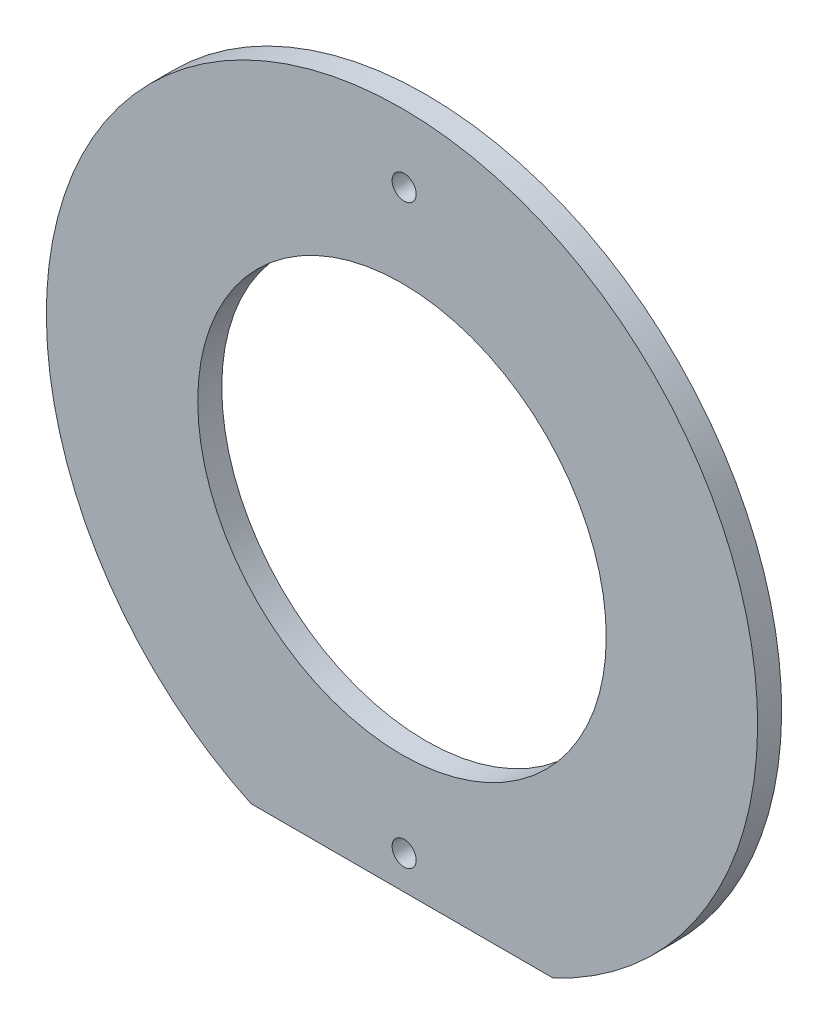
ISO-10303-21;
HEADER;
FILE_DESCRIPTION(('STEP AP214'),'2;1');
FILE_NAME('part.step','',(''),(''),'','','');
FILE_SCHEMA(('AUTOMOTIVE_DESIGN { 1 0 10303 214 1 1 1 1 }'));
ENDSEC;
DATA;
#1=APPLICATION_CONTEXT('core data for automotive mechanical design processes');
#2=APPLICATION_PROTOCOL_DEFINITION('international standard','automotive_design',2000,#1);
#3=PRODUCT_CONTEXT('',#1,'mechanical');
#4=PRODUCT('Part','Part','',(#3));
#5=PRODUCT_RELATED_PRODUCT_CATEGORY('part','',(#4));
#6=PRODUCT_DEFINITION_FORMATION('','',#4);
#7=PRODUCT_DEFINITION_CONTEXT('part definition',#1,'design');
#8=PRODUCT_DEFINITION('design','',#6,#7);
#9=PRODUCT_DEFINITION_SHAPE('','',#8);
#10=(LENGTH_UNIT() NAMED_UNIT(*) SI_UNIT(.MILLI.,.METRE.));
#11=(NAMED_UNIT(*) PLANE_ANGLE_UNIT() SI_UNIT($,.RADIAN.));
#12=(NAMED_UNIT(*) SI_UNIT($,.STERADIAN.) SOLID_ANGLE_UNIT());
#13=UNCERTAINTY_MEASURE_WITH_UNIT(LENGTH_MEASURE(1.E-05),#10,'distance_accuracy_value','');
#14=(GEOMETRIC_REPRESENTATION_CONTEXT(3) GLOBAL_UNCERTAINTY_ASSIGNED_CONTEXT((#13)) GLOBAL_UNIT_ASSIGNED_CONTEXT((#10,
#11,#12)) REPRESENTATION_CONTEXT('',''));
#15=CARTESIAN_POINT('',(0.,0.,0.));
#16=DIRECTION('',(0.,0.,1.));
#17=DIRECTION('',(1.,0.,0.));
#18=AXIS2_PLACEMENT_3D('',#15,#16,#17);
#19=CARTESIAN_POINT('',(-94.397031795319,72.5024096010838,5.));
#20=DIRECTION('',(0.,0.,-1.));
#21=DIRECTION('',(-1.,0.,0.));
#22=AXIS2_PLACEMENT_3D('',#19,#20,#21);
#23=CYLINDRICAL_SURFACE('',#22,74.);
#24=CARTESIAN_POINT('',(-94.397031795319,72.5024096010838,0.));
#25=DIRECTION('',(0.,0.,1.));
#26=DIRECTION('',(1.,0.,0.));
#27=AXIS2_PLACEMENT_3D('',#24,#25,#26);
#28=CIRCLE('',#27,74.);
#29=CARTESIAN_POINT('',(-62.980475650509,5.50240960108384,0.));
#30=VERTEX_POINT('',#29);
#31=CARTESIAN_POINT('',(-125.813587940129,5.50240960108384,0.));
#32=VERTEX_POINT('',#31);
#33=EDGE_CURVE('E72',#30,#32,#28,.T.);
#34=ORIENTED_EDGE('',*,*,#33,.T.);
#35=DIRECTION('',(0.,0.,-1.));
#36=VECTOR('',#35,1.);
#37=CARTESIAN_POINT('',(-125.813587940129,5.50240960108384,5.));
#38=LINE('',#37,#36);
#39=CARTESIAN_POINT('',(-125.813587940129,5.50240960108384,5.));
#40=VERTEX_POINT('',#39);
#41=EDGE_CURVE('E11',#40,#32,#38,.T.);
#42=ORIENTED_EDGE('',*,*,#41,.F.);
#43=CARTESIAN_POINT('',(-94.397031795319,72.5024096010838,5.));
#44=DIRECTION('',(0.,0.,1.));
#45=DIRECTION('',(1.,0.,0.));
#46=AXIS2_PLACEMENT_3D('',#43,#44,#45);
#47=CIRCLE('',#46,74.);
#48=CARTESIAN_POINT('',(-62.980475650509,5.50240960108384,5.));
#49=VERTEX_POINT('',#48);
#50=EDGE_CURVE('E71',#49,#40,#47,.T.);
#51=ORIENTED_EDGE('',*,*,#50,.F.);
#52=DIRECTION('',(0.,0.,-1.));
#53=VECTOR('',#52,1.);
#54=CARTESIAN_POINT('',(-62.980475650509,5.50240960108384,5.));
#55=LINE('',#54,#53);
#56=EDGE_CURVE('E48',#49,#30,#55,.T.);
#57=ORIENTED_EDGE('',*,*,#56,.T.);
#58=EDGE_LOOP('',(#34,#42,#51,#57));
#59=FACE_BOUND('',#58,.T.);
#60=ADVANCED_FACE('F39',(#59),#23,.T.);
#61=CARTESIAN_POINT('',(-125.813587940129,5.50240960108384,5.));
#62=DIRECTION('',(0.,1.,0.));
#63=DIRECTION('',(0.,0.,1.));
#64=AXIS2_PLACEMENT_3D('',#61,#62,#63);
#65=PLANE('',#64);
#66=DIRECTION('',(1.,0.,0.));
#67=VECTOR('',#66,1.);
#68=CARTESIAN_POINT('',(-125.813587940129,5.50240960108384,0.));
#69=LINE('',#68,#67);
#70=EDGE_CURVE('E64',#32,#30,#69,.T.);
#71=ORIENTED_EDGE('',*,*,#70,.T.);
#72=ORIENTED_EDGE('',*,*,#56,.F.);
#73=DIRECTION('',(1.,0.,0.));
#74=VECTOR('',#73,1.);
#75=CARTESIAN_POINT('',(-125.813587940129,5.50240960108384,5.));
#76=LINE('',#75,#74);
#77=EDGE_CURVE('E56',#40,#49,#76,.T.);
#78=ORIENTED_EDGE('',*,*,#77,.F.);
#79=ORIENTED_EDGE('',*,*,#41,.T.);
#80=EDGE_LOOP('',(#71,#72,#78,#79));
#81=FACE_BOUND('',#80,.T.);
#82=ADVANCED_FACE('F67',(#81),#65,.F.);
#83=CARTESIAN_POINT('',(-94.397031795319,72.5024096010838,5.));
#84=DIRECTION('',(0.,0.,1.));
#85=DIRECTION('',(1.,0.,0.));
#86=AXIS2_PLACEMENT_3D('',#83,#84,#85);
#87=PLANE('',#86);
#88=CARTESIAN_POINT('',(-94.397031795319,72.5024096010838,5.));
#89=DIRECTION('',(0.,0.,1.));
#90=DIRECTION('',(1.,0.,0.));
#91=AXIS2_PLACEMENT_3D('',#88,#89,#90);
#92=CIRCLE('',#91,42.5);
#93=CARTESIAN_POINT('',(-51.897031795319,72.5024096010838,5.));
#94=VERTEX_POINT('',#93);
#95=EDGE_CURVE('E158',#94,#94,#92,.T.);
#96=ORIENTED_EDGE('',*,*,#95,.F.);
#97=EDGE_LOOP('',(#96));
#98=FACE_BOUND('',#97,.T.);
#99=CARTESIAN_POINT('',(-93.9533952640978,132.502409601084,5.));
#100=DIRECTION('',(0.,0.,1.));
#101=DIRECTION('',(1.,0.,0.));
#102=AXIS2_PLACEMENT_3D('',#99,#100,#101);
#103=CIRCLE('',#102,2.5);
#104=CARTESIAN_POINT('',(-91.4533952640978,132.502409601084,5.));
#105=VERTEX_POINT('',#104);
#106=EDGE_CURVE('E83',#105,#105,#103,.T.);
#107=ORIENTED_EDGE('',*,*,#106,.F.);
#108=EDGE_LOOP('',(#107));
#109=FACE_BOUND('',#108,.T.);
#110=CARTESIAN_POINT('',(-93.9533952640978,12.5024096010838,5.));
#111=DIRECTION('',(0.,0.,1.));
#112=DIRECTION('',(1.,0.,0.));
#113=AXIS2_PLACEMENT_3D('',#110,#111,#112);
#114=CIRCLE('',#113,2.5);
#115=CARTESIAN_POINT('',(-91.4533952640978,12.5024096010838,5.));
#116=VERTEX_POINT('',#115);
#117=EDGE_CURVE('E87',#116,#116,#114,.T.);
#118=ORIENTED_EDGE('',*,*,#117,.F.);
#119=EDGE_LOOP('',(#118));
#120=FACE_BOUND('',#119,.T.);
#121=ORIENTED_EDGE('',*,*,#50,.T.);
#122=ORIENTED_EDGE('',*,*,#77,.T.);
#123=EDGE_LOOP('',(#121,#122));
#124=FACE_BOUND('',#123,.T.);
#125=ADVANCED_FACE('F96',(#98,#109,#120,#124),#87,.T.);
#126=CARTESIAN_POINT('',(-94.397031795319,72.5024096010838,0.));
#127=DIRECTION('',(0.,0.,1.));
#128=DIRECTION('',(1.,0.,0.));
#129=AXIS2_PLACEMENT_3D('',#126,#127,#128);
#130=PLANE('',#129);
#131=CARTESIAN_POINT('',(-94.397031795319,72.5024096010838,0.));
#132=DIRECTION('',(0.,0.,1.));
#133=DIRECTION('',(1.,0.,0.));
#134=AXIS2_PLACEMENT_3D('',#131,#132,#133);
#135=CIRCLE('',#134,42.5);
#136=CARTESIAN_POINT('',(-51.897031795319,72.5024096010838,0.));
#137=VERTEX_POINT('',#136);
#138=EDGE_CURVE('E92',#137,#137,#135,.F.);
#139=ORIENTED_EDGE('',*,*,#138,.F.);
#140=EDGE_LOOP('',(#139));
#141=FACE_BOUND('',#140,.T.);
#142=CARTESIAN_POINT('',(-93.9533952640978,132.502409601084,0.));
#143=DIRECTION('',(0.,0.,1.));
#144=DIRECTION('',(1.,0.,0.));
#145=AXIS2_PLACEMENT_3D('',#142,#143,#144);
#146=CIRCLE('',#145,2.5);
#147=CARTESIAN_POINT('',(-91.4533952640978,132.502409601084,0.));
#148=VERTEX_POINT('',#147);
#149=EDGE_CURVE('E42',#148,#148,#146,.T.);
#150=ORIENTED_EDGE('',*,*,#149,.T.);
#151=EDGE_LOOP('',(#150));
#152=FACE_BOUND('',#151,.T.);
#153=CARTESIAN_POINT('',(-93.9533952640978,12.5024096010838,0.));
#154=DIRECTION('',(0.,0.,1.));
#155=DIRECTION('',(1.,0.,0.));
#156=AXIS2_PLACEMENT_3D('',#153,#154,#155);
#157=CIRCLE('',#156,2.5);
#158=CARTESIAN_POINT('',(-91.4533952640978,12.5024096010838,0.));
#159=VERTEX_POINT('',#158);
#160=EDGE_CURVE('E79',#159,#159,#157,.T.);
#161=ORIENTED_EDGE('',*,*,#160,.T.);
#162=EDGE_LOOP('',(#161));
#163=FACE_BOUND('',#162,.T.);
#164=ORIENTED_EDGE('',*,*,#33,.F.);
#165=ORIENTED_EDGE('',*,*,#70,.F.);
#166=EDGE_LOOP('',(#164,#165));
#167=FACE_BOUND('',#166,.T.);
#168=ADVANCED_FACE('F76',(#141,#152,#163,#167),#130,.F.);
#169=CARTESIAN_POINT('',(-93.9533952640978,12.5024096010838,-5.));
#170=DIRECTION('',(0.,0.,1.));
#171=DIRECTION('',(1.,0.,0.));
#172=AXIS2_PLACEMENT_3D('',#169,#170,#171);
#173=CYLINDRICAL_SURFACE('',#172,2.5);
#174=ORIENTED_EDGE('',*,*,#117,.T.);
#175=EDGE_LOOP('',(#174));
#176=FACE_BOUND('',#175,.T.);
#177=ORIENTED_EDGE('',*,*,#160,.F.);
#178=EDGE_LOOP('',(#177));
#179=FACE_BOUND('',#178,.T.);
#180=ADVANCED_FACE('F104',(#176,#179),#173,.F.);
#181=CARTESIAN_POINT('',(-93.9533952640978,132.502409601084,-5.));
#182=DIRECTION('',(0.,0.,1.));
#183=DIRECTION('',(1.,0.,0.));
#184=AXIS2_PLACEMENT_3D('',#181,#182,#183);
#185=CYLINDRICAL_SURFACE('',#184,2.5);
#186=ORIENTED_EDGE('',*,*,#106,.T.);
#187=EDGE_LOOP('',(#186));
#188=FACE_BOUND('',#187,.T.);
#189=ORIENTED_EDGE('',*,*,#149,.F.);
#190=EDGE_LOOP('',(#189));
#191=FACE_BOUND('',#190,.T.);
#192=ADVANCED_FACE('F136',(#188,#191),#185,.F.);
#193=CARTESIAN_POINT('',(-94.397031795319,72.5024096010838,-0.00100000000000013));
#194=DIRECTION('',(0.,0.,1.));
#195=DIRECTION('',(1.,0.,0.));
#196=AXIS2_PLACEMENT_3D('',#193,#194,#195);
#197=CYLINDRICAL_SURFACE('',#196,42.5);
#198=ORIENTED_EDGE('',*,*,#95,.T.);
#199=EDGE_LOOP('',(#198));
#200=FACE_BOUND('',#199,.T.);
#201=ORIENTED_EDGE('',*,*,#138,.T.);
#202=EDGE_LOOP('',(#201));
#203=FACE_BOUND('',#202,.T.);
#204=ADVANCED_FACE('F141',(#200,#203),#197,.F.);
#205=CLOSED_SHELL('',(#60,#82,#125,#168,#180,#192,#204));
#206=MANIFOLD_SOLID_BREP('B2',#205);
#207=ADVANCED_BREP_SHAPE_REPRESENTATION('',(#18,#206),#14);
#208=SHAPE_DEFINITION_REPRESENTATION(#9,#207);
ENDSEC;
END-ISO-10303-21;
